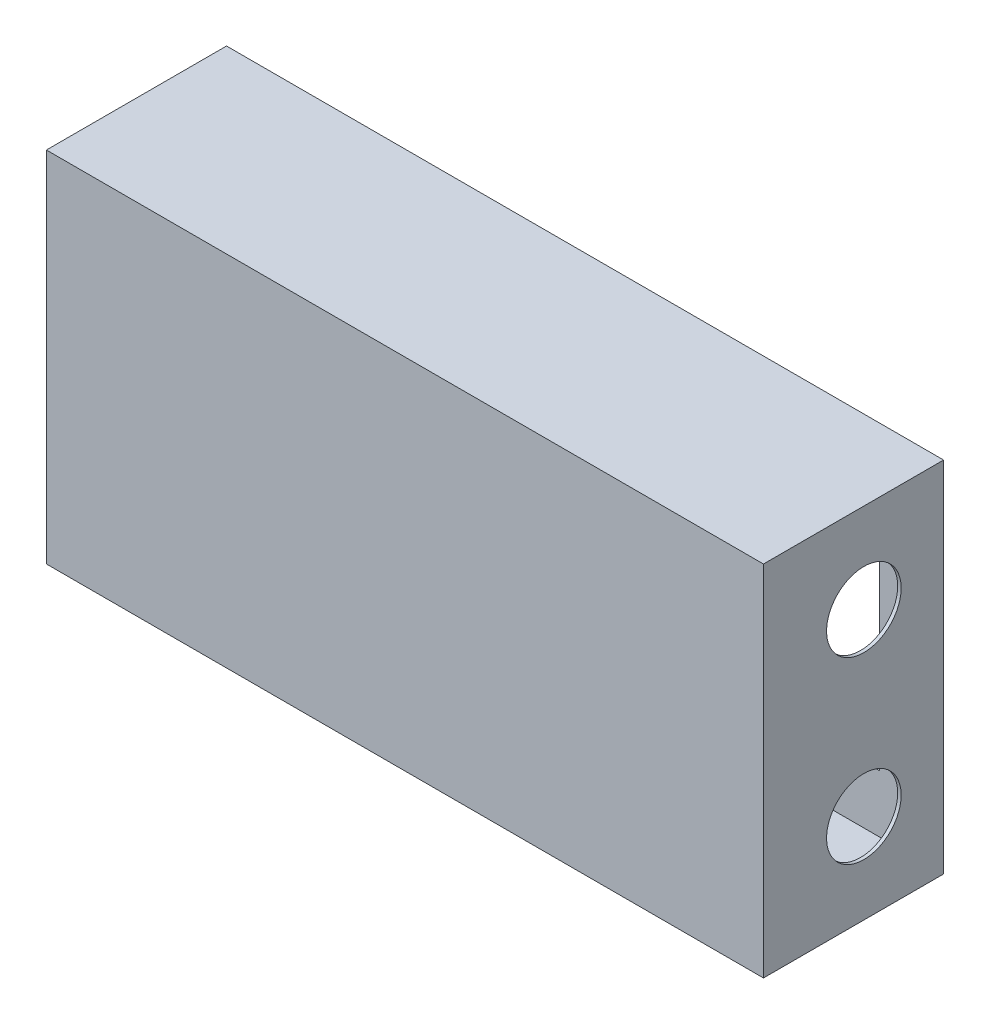
ISO-10303-21;
HEADER;
FILE_DESCRIPTION(('STEP AP214'),'2;1');
FILE_NAME('part.step','',(''),(''),'','','');
FILE_SCHEMA(('AUTOMOTIVE_DESIGN { 1 0 10303 214 1 1 1 1 }'));
ENDSEC;
DATA;
#1=APPLICATION_CONTEXT('core data for automotive mechanical design processes');
#2=APPLICATION_PROTOCOL_DEFINITION('international standard','automotive_design',2000,#1);
#3=PRODUCT_CONTEXT('',#1,'mechanical');
#4=PRODUCT('Part','Part','',(#3));
#5=PRODUCT_RELATED_PRODUCT_CATEGORY('part','',(#4));
#6=PRODUCT_DEFINITION_FORMATION('','',#4);
#7=PRODUCT_DEFINITION_CONTEXT('part definition',#1,'design');
#8=PRODUCT_DEFINITION('design','',#6,#7);
#9=PRODUCT_DEFINITION_SHAPE('','',#8);
#10=(LENGTH_UNIT() NAMED_UNIT(*) SI_UNIT(.MILLI.,.METRE.));
#11=(NAMED_UNIT(*) PLANE_ANGLE_UNIT() SI_UNIT($,.RADIAN.));
#12=(NAMED_UNIT(*) SI_UNIT($,.STERADIAN.) SOLID_ANGLE_UNIT());
#13=UNCERTAINTY_MEASURE_WITH_UNIT(LENGTH_MEASURE(1.E-05),#10,'distance_accuracy_value','');
#14=(GEOMETRIC_REPRESENTATION_CONTEXT(3) GLOBAL_UNCERTAINTY_ASSIGNED_CONTEXT((#13)) GLOBAL_UNIT_ASSIGNED_CONTEXT((#10,
#11,#12)) REPRESENTATION_CONTEXT('',''));
#15=CARTESIAN_POINT('',(0.,0.,0.));
#16=DIRECTION('',(0.,0.,1.));
#17=DIRECTION('',(1.,0.,0.));
#18=AXIS2_PLACEMENT_3D('',#15,#16,#17);
#19=CARTESIAN_POINT('',(400.,0.,73.6));
#20=DIRECTION('',(0.,0.,1.));
#21=DIRECTION('',(1.,0.,0.));
#22=AXIS2_PLACEMENT_3D('',#19,#20,#21);
#23=PLANE('',#22);
#24=DIRECTION('',(-1.,0.,0.));
#25=VECTOR('',#24,1.);
#26=CARTESIAN_POINT('',(-115.,-42.5,73.6));
#27=LINE('',#26,#25);
#28=CARTESIAN_POINT('',(115.,-42.5,73.6));
#29=VERTEX_POINT('',#28);
#30=CARTESIAN_POINT('',(-115.,-42.5,73.6));
#31=VERTEX_POINT('',#30);
#32=EDGE_CURVE('E142',#29,#31,#27,.T.);
#33=ORIENTED_EDGE('',*,*,#32,.F.);
#34=DIRECTION('',(0.,-1.,0.));
#35=VECTOR('',#34,1.);
#36=CARTESIAN_POINT('',(115.,-42.5,73.6));
#37=LINE('',#36,#35);
#38=CARTESIAN_POINT('',(115.,42.5,73.6));
#39=VERTEX_POINT('',#38);
#40=EDGE_CURVE('E90',#39,#29,#37,.T.);
#41=ORIENTED_EDGE('',*,*,#40,.F.);
#42=DIRECTION('',(1.,0.,0.));
#43=VECTOR('',#42,1.);
#44=CARTESIAN_POINT('',(-115.,42.5,73.6));
#45=LINE('',#44,#43);
#46=CARTESIAN_POINT('',(-115.,42.5,73.6));
#47=VERTEX_POINT('',#46);
#48=EDGE_CURVE('E170',#47,#39,#45,.T.);
#49=ORIENTED_EDGE('',*,*,#48,.F.);
#50=DIRECTION('',(0.,1.,0.));
#51=VECTOR('',#50,1.);
#52=CARTESIAN_POINT('',(-115.,-42.5,73.6));
#53=LINE('',#52,#51);
#54=EDGE_CURVE('E146',#31,#47,#53,.T.);
#55=ORIENTED_EDGE('',*,*,#54,.F.);
#56=EDGE_LOOP('',(#33,#41,#49,#55));
#57=FACE_BOUND('',#56,.T.);
#58=DIRECTION('',(0.,-1.,0.));
#59=VECTOR('',#58,1.);
#60=CARTESIAN_POINT('',(113.8,0.,73.6));
#61=LINE('',#60,#59);
#62=CARTESIAN_POINT('',(113.8,41.3,73.6));
#63=VERTEX_POINT('',#62);
#64=CARTESIAN_POINT('',(113.8,-41.3,73.6));
#65=VERTEX_POINT('',#64);
#66=EDGE_CURVE('E137',#63,#65,#61,.T.);
#67=ORIENTED_EDGE('',*,*,#66,.T.);
#68=DIRECTION('',(-1.,0.,0.));
#69=VECTOR('',#68,1.);
#70=CARTESIAN_POINT('',(400.,-41.3000000000001,73.6));
#71=LINE('',#70,#69);
#72=CARTESIAN_POINT('',(-113.8,-41.3,73.6));
#73=VERTEX_POINT('',#72);
#74=EDGE_CURVE('E156',#65,#73,#71,.T.);
#75=ORIENTED_EDGE('',*,*,#74,.T.);
#76=DIRECTION('',(0.,1.,0.));
#77=VECTOR('',#76,1.);
#78=CARTESIAN_POINT('',(-113.8,0.,73.6));
#79=LINE('',#78,#77);
#80=CARTESIAN_POINT('',(-113.8,41.3,73.6));
#81=VERTEX_POINT('',#80);
#82=EDGE_CURVE('E141',#73,#81,#79,.T.);
#83=ORIENTED_EDGE('',*,*,#82,.T.);
#84=DIRECTION('',(1.,0.,0.));
#85=VECTOR('',#84,1.);
#86=CARTESIAN_POINT('',(400.,41.2999999999999,73.6));
#87=LINE('',#86,#85);
#88=EDGE_CURVE('E60',#81,#63,#87,.T.);
#89=ORIENTED_EDGE('',*,*,#88,.T.);
#90=EDGE_LOOP('',(#67,#75,#83,#89));
#91=FACE_BOUND('',#90,.T.);
#92=ADVANCED_FACE('F45',(#57,#91),#23,.T.);
#93=CARTESIAN_POINT('',(-115.,-42.5,58.6));
#94=DIRECTION('',(0.,1.,0.));
#95=DIRECTION('',(-1.,0.,0.));
#96=AXIS2_PLACEMENT_3D('',#93,#94,#95);
#97=PLANE('',#96);
#98=ORIENTED_EDGE('',*,*,#32,.T.);
#99=DIRECTION('',(0.,0.,1.));
#100=VECTOR('',#99,1.);
#101=CARTESIAN_POINT('',(-115.,-42.5,58.6));
#102=LINE('',#101,#100);
#103=CARTESIAN_POINT('',(-115.,-42.5,58.6));
#104=VERTEX_POINT('',#103);
#105=EDGE_CURVE('E12',#104,#31,#102,.T.);
#106=ORIENTED_EDGE('',*,*,#105,.F.);
#107=DIRECTION('',(-1.,0.,0.));
#108=VECTOR('',#107,1.);
#109=CARTESIAN_POINT('',(-115.,-42.5,58.6));
#110=LINE('',#109,#108);
#111=CARTESIAN_POINT('',(115.,-42.5,58.6));
#112=VERTEX_POINT('',#111);
#113=EDGE_CURVE('E162',#112,#104,#110,.T.);
#114=ORIENTED_EDGE('',*,*,#113,.F.);
#115=DIRECTION('',(0.,0.,1.));
#116=VECTOR('',#115,1.);
#117=CARTESIAN_POINT('',(115.,-42.5,58.6));
#118=LINE('',#117,#116);
#119=EDGE_CURVE('E167',#112,#29,#118,.T.);
#120=ORIENTED_EDGE('',*,*,#119,.T.);
#121=EDGE_LOOP('',(#98,#106,#114,#120));
#122=FACE_BOUND('',#121,.T.);
#123=ADVANCED_FACE('F47',(#122),#97,.F.);
#124=CARTESIAN_POINT('',(-115.,-42.5,58.6));
#125=DIRECTION('',(1.,0.,0.));
#126=DIRECTION('',(0.,0.,-1.));
#127=AXIS2_PLACEMENT_3D('',#124,#125,#126);
#128=PLANE('',#127);
#129=ORIENTED_EDGE('',*,*,#54,.T.);
#130=DIRECTION('',(0.,0.,1.));
#131=VECTOR('',#130,1.);
#132=CARTESIAN_POINT('',(-115.,42.5,58.6));
#133=LINE('',#132,#131);
#134=CARTESIAN_POINT('',(-115.,42.5,58.6));
#135=VERTEX_POINT('',#134);
#136=EDGE_CURVE('E53',#135,#47,#133,.T.);
#137=ORIENTED_EDGE('',*,*,#136,.F.);
#138=DIRECTION('',(0.,1.,0.));
#139=VECTOR('',#138,1.);
#140=CARTESIAN_POINT('',(-115.,-42.5,58.6));
#141=LINE('',#140,#139);
#142=EDGE_CURVE('E97',#104,#135,#141,.T.);
#143=ORIENTED_EDGE('',*,*,#142,.F.);
#144=ORIENTED_EDGE('',*,*,#105,.T.);
#145=EDGE_LOOP('',(#129,#137,#143,#144));
#146=FACE_BOUND('',#145,.T.);
#147=ADVANCED_FACE('F196',(#146),#128,.F.);
#148=CARTESIAN_POINT('',(-115.,42.5,58.6));
#149=DIRECTION('',(0.,-1.,0.));
#150=DIRECTION('',(1.,0.,0.));
#151=AXIS2_PLACEMENT_3D('',#148,#149,#150);
#152=PLANE('',#151);
#153=ORIENTED_EDGE('',*,*,#48,.T.);
#154=DIRECTION('',(0.,0.,1.));
#155=VECTOR('',#154,1.);
#156=CARTESIAN_POINT('',(115.,42.5,58.6));
#157=LINE('',#156,#155);
#158=CARTESIAN_POINT('',(115.,42.5,58.6));
#159=VERTEX_POINT('',#158);
#160=EDGE_CURVE('E174',#159,#39,#157,.T.);
#161=ORIENTED_EDGE('',*,*,#160,.F.);
#162=DIRECTION('',(1.,0.,0.));
#163=VECTOR('',#162,1.);
#164=CARTESIAN_POINT('',(-115.,42.5,58.6));
#165=LINE('',#164,#163);
#166=EDGE_CURVE('E165',#135,#159,#165,.T.);
#167=ORIENTED_EDGE('',*,*,#166,.F.);
#168=ORIENTED_EDGE('',*,*,#136,.T.);
#169=EDGE_LOOP('',(#153,#161,#167,#168));
#170=FACE_BOUND('',#169,.T.);
#171=ADVANCED_FACE('F179',(#170),#152,.F.);
#172=CARTESIAN_POINT('',(115.,-42.5,58.6));
#173=DIRECTION('',(-1.,0.,0.));
#174=DIRECTION('',(0.,0.,1.));
#175=AXIS2_PLACEMENT_3D('',#172,#173,#174);
#176=PLANE('',#175);
#177=ORIENTED_EDGE('',*,*,#40,.T.);
#178=ORIENTED_EDGE('',*,*,#119,.F.);
#179=DIRECTION('',(0.,-1.,0.));
#180=VECTOR('',#179,1.);
#181=CARTESIAN_POINT('',(115.,-42.5,58.6));
#182=LINE('',#181,#180);
#183=EDGE_CURVE('E69',#159,#112,#182,.T.);
#184=ORIENTED_EDGE('',*,*,#183,.F.);
#185=ORIENTED_EDGE('',*,*,#160,.T.);
#186=EDGE_LOOP('',(#177,#178,#184,#185));
#187=FACE_BOUND('',#186,.T.);
#188=ADVANCED_FACE('F187',(#187),#176,.F.);
#189=CARTESIAN_POINT('',(400.,0.,58.6));
#190=DIRECTION('',(0.,0.,1.));
#191=DIRECTION('',(1.,0.,0.));
#192=AXIS2_PLACEMENT_3D('',#189,#190,#191);
#193=PLANE('',#192);
#194=ORIENTED_EDGE('',*,*,#113,.T.);
#195=ORIENTED_EDGE('',*,*,#142,.T.);
#196=ORIENTED_EDGE('',*,*,#166,.T.);
#197=ORIENTED_EDGE('',*,*,#183,.T.);
#198=EDGE_LOOP('',(#194,#195,#196,#197));
#199=FACE_BOUND('',#198,.T.);
#200=ADVANCED_FACE('F189',(#199),#193,.F.);
#201=CARTESIAN_POINT('',(-115.,-41.3,58.6));
#202=DIRECTION('',(0.,1.,0.));
#203=DIRECTION('',(-1.,0.,0.));
#204=AXIS2_PLACEMENT_3D('',#201,#202,#203);
#205=PLANE('',#204);
#206=ORIENTED_EDGE('',*,*,#74,.F.);
#207=DIRECTION('',(0.,0.,1.));
#208=VECTOR('',#207,1.);
#209=CARTESIAN_POINT('',(113.8,-41.3,58.6));
#210=LINE('',#209,#208);
#211=CARTESIAN_POINT('',(113.8,-41.3,59.8));
#212=VERTEX_POINT('',#211);
#213=EDGE_CURVE('E136',#212,#65,#210,.T.);
#214=ORIENTED_EDGE('',*,*,#213,.F.);
#215=DIRECTION('',(-1.,0.,0.));
#216=VECTOR('',#215,1.);
#217=CARTESIAN_POINT('',(400.,-41.3000000000001,59.8));
#218=LINE('',#217,#216);
#219=CARTESIAN_POINT('',(-113.8,-41.3,59.8));
#220=VERTEX_POINT('',#219);
#221=EDGE_CURVE('E124',#212,#220,#218,.T.);
#222=ORIENTED_EDGE('',*,*,#221,.T.);
#223=DIRECTION('',(0.,0.,1.));
#224=VECTOR('',#223,1.);
#225=CARTESIAN_POINT('',(-113.8,-41.3,58.6));
#226=LINE('',#225,#224);
#227=EDGE_CURVE('E134',#220,#73,#226,.T.);
#228=ORIENTED_EDGE('',*,*,#227,.T.);
#229=EDGE_LOOP('',(#206,#214,#222,#228));
#230=FACE_BOUND('',#229,.T.);
#231=ADVANCED_FACE('F133',(#230),#205,.T.);
#232=CARTESIAN_POINT('',(-113.8,-42.5,58.6));
#233=DIRECTION('',(1.,0.,0.));
#234=DIRECTION('',(0.,0.,-1.));
#235=AXIS2_PLACEMENT_3D('',#232,#233,#234);
#236=PLANE('',#235);
#237=ORIENTED_EDGE('',*,*,#82,.F.);
#238=ORIENTED_EDGE('',*,*,#227,.F.);
#239=DIRECTION('',(0.,1.,0.));
#240=VECTOR('',#239,1.);
#241=CARTESIAN_POINT('',(-113.8,0.,59.8));
#242=LINE('',#241,#240);
#243=CARTESIAN_POINT('',(-113.8,41.3,59.8));
#244=VERTEX_POINT('',#243);
#245=EDGE_CURVE('E120',#220,#244,#242,.T.);
#246=ORIENTED_EDGE('',*,*,#245,.T.);
#247=DIRECTION('',(0.,0.,1.));
#248=VECTOR('',#247,1.);
#249=CARTESIAN_POINT('',(-113.8,41.3,58.6));
#250=LINE('',#249,#248);
#251=EDGE_CURVE('E143',#244,#81,#250,.T.);
#252=ORIENTED_EDGE('',*,*,#251,.T.);
#253=EDGE_LOOP('',(#237,#238,#246,#252));
#254=FACE_BOUND('',#253,.T.);
#255=ADVANCED_FACE('F139',(#254),#236,.T.);
#256=CARTESIAN_POINT('',(-115.,41.3,58.6));
#257=DIRECTION('',(0.,-1.,0.));
#258=DIRECTION('',(1.,0.,0.));
#259=AXIS2_PLACEMENT_3D('',#256,#257,#258);
#260=PLANE('',#259);
#261=ORIENTED_EDGE('',*,*,#88,.F.);
#262=ORIENTED_EDGE('',*,*,#251,.F.);
#263=DIRECTION('',(1.,0.,0.));
#264=VECTOR('',#263,1.);
#265=CARTESIAN_POINT('',(400.,41.2999999999999,59.8));
#266=LINE('',#265,#264);
#267=CARTESIAN_POINT('',(113.8,41.3,59.8));
#268=VERTEX_POINT('',#267);
#269=EDGE_CURVE('E125',#244,#268,#266,.T.);
#270=ORIENTED_EDGE('',*,*,#269,.T.);
#271=DIRECTION('',(0.,0.,1.));
#272=VECTOR('',#271,1.);
#273=CARTESIAN_POINT('',(113.8,41.3,58.6));
#274=LINE('',#273,#272);
#275=EDGE_CURVE('E148',#268,#63,#274,.T.);
#276=ORIENTED_EDGE('',*,*,#275,.T.);
#277=EDGE_LOOP('',(#261,#262,#270,#276));
#278=FACE_BOUND('',#277,.T.);
#279=ADVANCED_FACE('F209',(#278),#260,.T.);
#280=CARTESIAN_POINT('',(113.8,-42.5,58.6));
#281=DIRECTION('',(-1.,0.,0.));
#282=DIRECTION('',(0.,0.,1.));
#283=AXIS2_PLACEMENT_3D('',#280,#281,#282);
#284=PLANE('',#283);
#285=ORIENTED_EDGE('',*,*,#66,.F.);
#286=ORIENTED_EDGE('',*,*,#275,.F.);
#287=DIRECTION('',(0.,-1.,0.));
#288=VECTOR('',#287,1.);
#289=CARTESIAN_POINT('',(113.8,0.,59.8));
#290=LINE('',#289,#288);
#291=EDGE_CURVE('E151',#268,#212,#290,.T.);
#292=ORIENTED_EDGE('',*,*,#291,.T.);
#293=ORIENTED_EDGE('',*,*,#213,.T.);
#294=EDGE_LOOP('',(#285,#286,#292,#293));
#295=FACE_BOUND('',#294,.T.);
#296=ADVANCED_FACE('F206',(#295),#284,.T.);
#297=CARTESIAN_POINT('',(400.,0.,59.8));
#298=DIRECTION('',(0.,0.,1.));
#299=DIRECTION('',(1.,0.,0.));
#300=AXIS2_PLACEMENT_3D('',#297,#298,#299);
#301=PLANE('',#300);
#302=ORIENTED_EDGE('',*,*,#221,.F.);
#303=ORIENTED_EDGE('',*,*,#291,.F.);
#304=ORIENTED_EDGE('',*,*,#269,.F.);
#305=ORIENTED_EDGE('',*,*,#245,.F.);
#306=EDGE_LOOP('',(#302,#303,#304,#305));
#307=FACE_BOUND('',#306,.T.);
#308=ADVANCED_FACE('F122',(#307),#301,.T.);
#309=CLOSED_SHELL('',(#92,#123,#147,#171,#188,#200,#231,#255,#279,#296,#308));
#310=MANIFOLD_SOLID_BREP('B2',#309);
#311=CARTESIAN_POINT('',(-125.,-62.5,74.8));
#312=DIRECTION('',(0.,1.,0.));
#313=DIRECTION('',(-1.,0.,0.));
#314=AXIS2_PLACEMENT_3D('',#311,#312,#313);
#315=PLANE('',#314);
#316=DIRECTION('',(0.,0.,-1.));
#317=VECTOR('',#316,1.);
#318=CARTESIAN_POINT('',(-125.,-62.5,74.8));
#319=LINE('',#318,#317);
#320=CARTESIAN_POINT('',(-125.,-62.5,74.8));
#321=VERTEX_POINT('',#320);
#322=CARTESIAN_POINT('',(-125.,-62.5,12.));
#323=VERTEX_POINT('',#322);
#324=EDGE_CURVE('E592',#321,#323,#319,.T.);
#325=ORIENTED_EDGE('',*,*,#324,.T.);
#326=DIRECTION('',(1.,0.,0.));
#327=VECTOR('',#326,1.);
#328=CARTESIAN_POINT('',(-125.,-62.5,12.));
#329=LINE('',#328,#327);
#330=CARTESIAN_POINT('',(125.,-62.5,12.));
#331=VERTEX_POINT('',#330);
#332=EDGE_CURVE('E307',#323,#331,#329,.T.);
#333=ORIENTED_EDGE('',*,*,#332,.T.);
#334=DIRECTION('',(0.,0.,-1.));
#335=VECTOR('',#334,1.);
#336=CARTESIAN_POINT('',(125.,-62.5,74.8));
#337=LINE('',#336,#335);
#338=CARTESIAN_POINT('',(125.,-62.5,74.8));
#339=VERTEX_POINT('',#338);
#340=EDGE_CURVE('E43',#339,#331,#337,.T.);
#341=ORIENTED_EDGE('',*,*,#340,.F.);
#342=DIRECTION('',(1.,0.,0.));
#343=VECTOR('',#342,1.);
#344=CARTESIAN_POINT('',(-125.,-62.5,74.8));
#345=LINE('',#344,#343);
#346=EDGE_CURVE('E583',#321,#339,#345,.T.);
#347=ORIENTED_EDGE('',*,*,#346,.F.);
#348=EDGE_LOOP('',(#325,#333,#341,#347));
#349=FACE_BOUND('',#348,.T.);
#350=ADVANCED_FACE('F283',(#349),#315,.F.);
#351=CARTESIAN_POINT('',(125.,-62.5,74.8));
#352=DIRECTION('',(-1.,0.,0.));
#353=DIRECTION('',(0.,0.,1.));
#354=AXIS2_PLACEMENT_3D('',#351,#352,#353);
#355=PLANE('',#354);
#356=CARTESIAN_POINT('',(125.,-31.25,39.8));
#357=DIRECTION('',(1.,0.,0.));
#358=DIRECTION('',(0.,0.,-1.));
#359=AXIS2_PLACEMENT_3D('',#356,#357,#358);
#360=CIRCLE('',#359,13.);
#361=CARTESIAN_POINT('',(125.,-31.25,26.8));
#362=VERTEX_POINT('',#361);
#363=EDGE_CURVE('E610',#362,#362,#360,.T.);
#364=ORIENTED_EDGE('',*,*,#363,.F.);
#365=EDGE_LOOP('',(#364));
#366=FACE_BOUND('',#365,.T.);
#367=CARTESIAN_POINT('',(125.,31.25,39.8));
#368=DIRECTION('',(1.,0.,0.));
#369=DIRECTION('',(0.,0.,-1.));
#370=AXIS2_PLACEMENT_3D('',#367,#368,#369);
#371=CIRCLE('',#370,13.);
#372=CARTESIAN_POINT('',(125.,31.25,26.8));
#373=VERTEX_POINT('',#372);
#374=EDGE_CURVE('E601',#373,#373,#371,.T.);
#375=ORIENTED_EDGE('',*,*,#374,.F.);
#376=EDGE_LOOP('',(#375));
#377=FACE_BOUND('',#376,.T.);
#378=ORIENTED_EDGE('',*,*,#340,.T.);
#379=DIRECTION('',(0.,1.,0.));
#380=VECTOR('',#379,1.);
#381=CARTESIAN_POINT('',(125.,-62.5,12.));
#382=LINE('',#381,#380);
#383=CARTESIAN_POINT('',(125.,62.5,12.));
#384=VERTEX_POINT('',#383);
#385=EDGE_CURVE('E580',#331,#384,#382,.T.);
#386=ORIENTED_EDGE('',*,*,#385,.T.);
#387=DIRECTION('',(0.,0.,-1.));
#388=VECTOR('',#387,1.);
#389=CARTESIAN_POINT('',(125.,62.5,74.8));
#390=LINE('',#389,#388);
#391=CARTESIAN_POINT('',(125.,62.5,74.8));
#392=VERTEX_POINT('',#391);
#393=EDGE_CURVE('E291',#392,#384,#390,.T.);
#394=ORIENTED_EDGE('',*,*,#393,.F.);
#395=DIRECTION('',(0.,1.,0.));
#396=VECTOR('',#395,1.);
#397=CARTESIAN_POINT('',(125.,-62.5,74.8));
#398=LINE('',#397,#396);
#399=EDGE_CURVE('E586',#339,#392,#398,.T.);
#400=ORIENTED_EDGE('',*,*,#399,.F.);
#401=EDGE_LOOP('',(#378,#386,#394,#400));
#402=FACE_BOUND('',#401,.T.);
#403=ADVANCED_FACE('F632',(#366,#377,#402),#355,.F.);
#404=CARTESIAN_POINT('',(-125.,62.5,74.8));
#405=DIRECTION('',(0.,-1.,0.));
#406=DIRECTION('',(0.,0.,-1.));
#407=AXIS2_PLACEMENT_3D('',#404,#405,#406);
#408=PLANE('',#407);
#409=ORIENTED_EDGE('',*,*,#393,.T.);
#410=DIRECTION('',(-1.,0.,0.));
#411=VECTOR('',#410,1.);
#412=CARTESIAN_POINT('',(125.,62.5,12.));
#413=LINE('',#412,#411);
#414=CARTESIAN_POINT('',(-125.,62.5,12.));
#415=VERTEX_POINT('',#414);
#416=EDGE_CURVE('E574',#384,#415,#413,.T.);
#417=ORIENTED_EDGE('',*,*,#416,.T.);
#418=DIRECTION('',(0.,0.,-1.));
#419=VECTOR('',#418,1.);
#420=CARTESIAN_POINT('',(-125.,62.5,74.8));
#421=LINE('',#420,#419);
#422=CARTESIAN_POINT('',(-125.,62.5,74.8));
#423=VERTEX_POINT('',#422);
#424=EDGE_CURVE('E595',#423,#415,#421,.T.);
#425=ORIENTED_EDGE('',*,*,#424,.F.);
#426=DIRECTION('',(-1.,0.,0.));
#427=VECTOR('',#426,1.);
#428=CARTESIAN_POINT('',(-125.,62.5,74.8));
#429=LINE('',#428,#427);
#430=EDGE_CURVE('E588',#392,#423,#429,.T.);
#431=ORIENTED_EDGE('',*,*,#430,.F.);
#432=EDGE_LOOP('',(#409,#417,#425,#431));
#433=FACE_BOUND('',#432,.T.);
#434=ADVANCED_FACE('F621',(#433),#408,.F.);
#435=CARTESIAN_POINT('',(-125.,-62.5,74.8));
#436=DIRECTION('',(1.,0.,0.));
#437=DIRECTION('',(0.,0.,-1.));
#438=AXIS2_PLACEMENT_3D('',#435,#436,#437);
#439=PLANE('',#438);
#440=CARTESIAN_POINT('',(-125.,0.,39.8));
#441=DIRECTION('',(-1.,0.,0.));
#442=DIRECTION('',(0.,0.,1.));
#443=AXIS2_PLACEMENT_3D('',#440,#441,#442);
#444=CIRCLE('',#443,13.);
#445=CARTESIAN_POINT('',(-125.,0.,52.8));
#446=VERTEX_POINT('',#445);
#447=EDGE_CURVE('E515',#446,#446,#444,.T.);
#448=ORIENTED_EDGE('',*,*,#447,.F.);
#449=EDGE_LOOP('',(#448));
#450=FACE_BOUND('',#449,.T.);
#451=ORIENTED_EDGE('',*,*,#424,.T.);
#452=DIRECTION('',(0.,-1.,0.));
#453=VECTOR('',#452,1.);
#454=CARTESIAN_POINT('',(-125.,62.5,12.));
#455=LINE('',#454,#453);
#456=EDGE_CURVE('E577',#415,#323,#455,.T.);
#457=ORIENTED_EDGE('',*,*,#456,.T.);
#458=ORIENTED_EDGE('',*,*,#324,.F.);
#459=DIRECTION('',(0.,-1.,0.));
#460=VECTOR('',#459,1.);
#461=CARTESIAN_POINT('',(-125.,-62.5,74.8));
#462=LINE('',#461,#460);
#463=EDGE_CURVE('E590',#423,#321,#462,.T.);
#464=ORIENTED_EDGE('',*,*,#463,.F.);
#465=EDGE_LOOP('',(#451,#457,#458,#464));
#466=FACE_BOUND('',#465,.T.);
#467=ADVANCED_FACE('F617',(#450,#466),#439,.F.);
#468=CARTESIAN_POINT('',(0.,0.,74.8));
#469=DIRECTION('',(0.,0.,1.));
#470=DIRECTION('',(1.,0.,0.));
#471=AXIS2_PLACEMENT_3D('',#468,#469,#470);
#472=PLANE('',#471);
#473=ORIENTED_EDGE('',*,*,#346,.T.);
#474=ORIENTED_EDGE('',*,*,#399,.T.);
#475=ORIENTED_EDGE('',*,*,#430,.T.);
#476=ORIENTED_EDGE('',*,*,#463,.T.);
#477=EDGE_LOOP('',(#473,#474,#475,#476));
#478=FACE_BOUND('',#477,.T.);
#479=ADVANCED_FACE('F620',(#478),#472,.T.);
#480=CARTESIAN_POINT('',(0.,0.,12.));
#481=DIRECTION('',(0.,0.,1.));
#482=DIRECTION('',(1.,0.,0.));
#483=AXIS2_PLACEMENT_3D('',#480,#481,#482);
#484=PLANE('',#483);
#485=ORIENTED_EDGE('',*,*,#416,.F.);
#486=ORIENTED_EDGE('',*,*,#385,.F.);
#487=ORIENTED_EDGE('',*,*,#332,.F.);
#488=ORIENTED_EDGE('',*,*,#456,.F.);
#489=EDGE_LOOP('',(#485,#486,#487,#488));
#490=FACE_BOUND('',#489,.T.);
#491=DIRECTION('',(-1.,0.,0.));
#492=VECTOR('',#491,1.);
#493=CARTESIAN_POINT('',(105.,42.5,12.));
#494=LINE('',#493,#492);
#495=CARTESIAN_POINT('',(105.,42.5,12.));
#496=VERTEX_POINT('',#495);
#497=CARTESIAN_POINT('',(-105.,42.5,12.));
#498=VERTEX_POINT('',#497);
#499=EDGE_CURVE('E544',#496,#498,#494,.T.);
#500=ORIENTED_EDGE('',*,*,#499,.T.);
#501=DIRECTION('',(0.,-1.,0.));
#502=VECTOR('',#501,1.);
#503=CARTESIAN_POINT('',(-105.,42.5,12.));
#504=LINE('',#503,#502);
#505=CARTESIAN_POINT('',(-105.,-42.5,12.));
#506=VERTEX_POINT('',#505);
#507=EDGE_CURVE('E547',#498,#506,#504,.T.);
#508=ORIENTED_EDGE('',*,*,#507,.T.);
#509=DIRECTION('',(1.,0.,0.));
#510=VECTOR('',#509,1.);
#511=CARTESIAN_POINT('',(-105.,-42.5,12.));
#512=LINE('',#511,#510);
#513=CARTESIAN_POINT('',(105.,-42.5,12.));
#514=VERTEX_POINT('',#513);
#515=EDGE_CURVE('E550',#506,#514,#512,.T.);
#516=ORIENTED_EDGE('',*,*,#515,.T.);
#517=DIRECTION('',(0.,1.,0.));
#518=VECTOR('',#517,1.);
#519=CARTESIAN_POINT('',(105.,-42.5,12.));
#520=LINE('',#519,#518);
#521=EDGE_CURVE('E542',#514,#496,#520,.T.);
#522=ORIENTED_EDGE('',*,*,#521,.T.);
#523=EDGE_LOOP('',(#500,#508,#516,#522));
#524=FACE_BOUND('',#523,.T.);
#525=ADVANCED_FACE('F629',(#490,#524),#484,.F.);
#526=CARTESIAN_POINT('',(105.,-42.5,12.));
#527=DIRECTION('',(-1.,0.,0.));
#528=DIRECTION('',(0.,0.,1.));
#529=AXIS2_PLACEMENT_3D('',#526,#527,#528);
#530=PLANE('',#529);
#531=DIRECTION('',(0.,1.,0.));
#532=VECTOR('',#531,1.);
#533=CARTESIAN_POINT('',(105.,-42.5,0.));
#534=LINE('',#533,#532);
#535=CARTESIAN_POINT('',(105.,-42.5,0.));
#536=VERTEX_POINT('',#535);
#537=CARTESIAN_POINT('',(105.,42.5,0.));
#538=VERTEX_POINT('',#537);
#539=EDGE_CURVE('E523',#536,#538,#534,.T.);
#540=ORIENTED_EDGE('',*,*,#539,.T.);
#541=DIRECTION('',(0.,0.,-1.));
#542=VECTOR('',#541,1.);
#543=CARTESIAN_POINT('',(105.,42.5,12.));
#544=LINE('',#543,#542);
#545=EDGE_CURVE('E571',#496,#538,#544,.T.);
#546=ORIENTED_EDGE('',*,*,#545,.F.);
#547=ORIENTED_EDGE('',*,*,#521,.F.);
#548=DIRECTION('',(0.,0.,-1.));
#549=VECTOR('',#548,1.);
#550=CARTESIAN_POINT('',(105.,-42.5,12.));
#551=LINE('',#550,#549);
#552=EDGE_CURVE('E552',#514,#536,#551,.T.);
#553=ORIENTED_EDGE('',*,*,#552,.T.);
#554=EDGE_LOOP('',(#540,#546,#547,#553));
#555=FACE_BOUND('',#554,.T.);
#556=ADVANCED_FACE('F642',(#555),#530,.F.);
#557=CARTESIAN_POINT('',(105.,42.5,12.));
#558=DIRECTION('',(0.,-1.,0.));
#559=DIRECTION('',(0.,0.,-1.));
#560=AXIS2_PLACEMENT_3D('',#557,#558,#559);
#561=PLANE('',#560);
#562=DIRECTION('',(-1.,0.,0.));
#563=VECTOR('',#562,1.);
#564=CARTESIAN_POINT('',(105.,42.5,0.));
#565=LINE('',#564,#563);
#566=CARTESIAN_POINT('',(-105.,42.5,0.));
#567=VERTEX_POINT('',#566);
#568=EDGE_CURVE('E555',#538,#567,#565,.T.);
#569=ORIENTED_EDGE('',*,*,#568,.T.);
#570=DIRECTION('',(0.,0.,-1.));
#571=VECTOR('',#570,1.);
#572=CARTESIAN_POINT('',(-105.,42.5,12.));
#573=LINE('',#572,#571);
#574=EDGE_CURVE('E568',#498,#567,#573,.T.);
#575=ORIENTED_EDGE('',*,*,#574,.F.);
#576=ORIENTED_EDGE('',*,*,#499,.F.);
#577=ORIENTED_EDGE('',*,*,#545,.T.);
#578=EDGE_LOOP('',(#569,#575,#576,#577));
#579=FACE_BOUND('',#578,.T.);
#580=ADVANCED_FACE('F747',(#579),#561,.F.);
#581=CARTESIAN_POINT('',(-105.,42.5,12.));
#582=DIRECTION('',(1.,0.,0.));
#583=DIRECTION('',(0.,0.,-1.));
#584=AXIS2_PLACEMENT_3D('',#581,#582,#583);
#585=PLANE('',#584);
#586=DIRECTION('',(0.,-1.,0.));
#587=VECTOR('',#586,1.);
#588=CARTESIAN_POINT('',(-105.,42.5,0.));
#589=LINE('',#588,#587);
#590=CARTESIAN_POINT('',(-105.,-42.5,0.));
#591=VERTEX_POINT('',#590);
#592=EDGE_CURVE('E558',#567,#591,#589,.T.);
#593=ORIENTED_EDGE('',*,*,#592,.T.);
#594=DIRECTION('',(0.,0.,-1.));
#595=VECTOR('',#594,1.);
#596=CARTESIAN_POINT('',(-105.,-42.5,12.));
#597=LINE('',#596,#595);
#598=EDGE_CURVE('E565',#506,#591,#597,.T.);
#599=ORIENTED_EDGE('',*,*,#598,.F.);
#600=ORIENTED_EDGE('',*,*,#507,.F.);
#601=ORIENTED_EDGE('',*,*,#574,.T.);
#602=EDGE_LOOP('',(#593,#599,#600,#601));
#603=FACE_BOUND('',#602,.T.);
#604=ADVANCED_FACE('F743',(#603),#585,.F.);
#605=CARTESIAN_POINT('',(-105.,-42.5,12.));
#606=DIRECTION('',(0.,1.,0.));
#607=DIRECTION('',(0.,0.,1.));
#608=AXIS2_PLACEMENT_3D('',#605,#606,#607);
#609=PLANE('',#608);
#610=DIRECTION('',(1.,0.,0.));
#611=VECTOR('',#610,1.);
#612=CARTESIAN_POINT('',(-105.,-42.5,0.));
#613=LINE('',#612,#611);
#614=EDGE_CURVE('E545',#591,#536,#613,.T.);
#615=ORIENTED_EDGE('',*,*,#614,.T.);
#616=ORIENTED_EDGE('',*,*,#552,.F.);
#617=ORIENTED_EDGE('',*,*,#515,.F.);
#618=ORIENTED_EDGE('',*,*,#598,.T.);
#619=EDGE_LOOP('',(#615,#616,#617,#618));
#620=FACE_BOUND('',#619,.T.);
#621=ADVANCED_FACE('F729',(#620),#609,.F.);
#622=CARTESIAN_POINT('',(105.,-42.5,0.));
#623=DIRECTION('',(0.707106781186546,0.,0.707106781186549));
#624=DIRECTION('',(0.707106781186549,0.,-0.707106781186546));
#625=AXIS2_PLACEMENT_3D('',#622,#623,#624);
#626=PLANE('',#625);
#627=ORIENTED_EDGE('',*,*,#539,.F.);
#628=DIRECTION('',(-0.577350269189627,0.577350269189627,0.577350269189624));
#629=VECTOR('',#628,1.);
#630=CARTESIAN_POINT('',(34.9999999999998,27.5000000000001,69.9999999999999));
#631=LINE('',#630,#629);
#632=CARTESIAN_POINT('',(109.,-46.5,-4.));
#633=VERTEX_POINT('',#632);
#634=EDGE_CURVE('E521',#633,#536,#631,.T.);
#635=ORIENTED_EDGE('',*,*,#634,.F.);
#636=DIRECTION('',(0.,1.,0.));
#637=VECTOR('',#636,1.);
#638=CARTESIAN_POINT('',(109.,0.,-4.));
#639=LINE('',#638,#637);
#640=CARTESIAN_POINT('',(109.,46.5,-4.));
#641=VERTEX_POINT('',#640);
#642=EDGE_CURVE('E458',#633,#641,#639,.T.);
#643=ORIENTED_EDGE('',*,*,#642,.T.);
#644=DIRECTION('',(-0.577350269189627,-0.577350269189627,0.577350269189624));
#645=VECTOR('',#644,1.);
#646=CARTESIAN_POINT('',(76.6666666666666,14.1666666666666,28.3333333333333));
#647=LINE('',#646,#645);
#648=EDGE_CURVE('E525',#641,#538,#647,.T.);
#649=ORIENTED_EDGE('',*,*,#648,.T.);
#650=EDGE_LOOP('',(#627,#635,#643,#649));
#651=FACE_BOUND('',#650,.T.);
#652=ADVANCED_FACE('F725',(#651),#626,.T.);
#653=CARTESIAN_POINT('',(-105.,-42.5,0.));
#654=DIRECTION('',(0.,-0.707106781186546,0.707106781186549));
#655=DIRECTION('',(0.,-0.707106781186549,-0.707106781186546));
#656=AXIS2_PLACEMENT_3D('',#653,#654,#655);
#657=PLANE('',#656);
#658=ORIENTED_EDGE('',*,*,#614,.F.);
#659=DIRECTION('',(0.577350269189627,0.577350269189627,0.577350269189624));
#660=VECTOR('',#659,1.);
#661=CARTESIAN_POINT('',(-76.6666666666665,-14.1666666666666,28.3333333333333));
#662=LINE('',#661,#660);
#663=CARTESIAN_POINT('',(-109.,-46.5,-4.));
#664=VERTEX_POINT('',#663);
#665=EDGE_CURVE('E524',#664,#591,#662,.T.);
#666=ORIENTED_EDGE('',*,*,#665,.F.);
#667=DIRECTION('',(1.,0.,0.));
#668=VECTOR('',#667,1.);
#669=CARTESIAN_POINT('',(0.,-46.5,-4.));
#670=LINE('',#669,#668);
#671=EDGE_CURVE('E528',#664,#633,#670,.T.);
#672=ORIENTED_EDGE('',*,*,#671,.T.);
#673=ORIENTED_EDGE('',*,*,#634,.T.);
#674=EDGE_LOOP('',(#658,#666,#672,#673));
#675=FACE_BOUND('',#674,.T.);
#676=ADVANCED_FACE('F728',(#675),#657,.T.);
#677=CARTESIAN_POINT('',(-105.,42.5,0.));
#678=DIRECTION('',(-0.707106781186546,0.,0.707106781186549));
#679=DIRECTION('',(0.707106781186549,0.,0.707106781186546));
#680=AXIS2_PLACEMENT_3D('',#677,#678,#679);
#681=PLANE('',#680);
#682=ORIENTED_EDGE('',*,*,#592,.F.);
#683=DIRECTION('',(0.577350269189627,-0.577350269189627,0.577350269189624));
#684=VECTOR('',#683,1.);
#685=CARTESIAN_POINT('',(-34.9999999999998,-27.5000000000002,69.9999999999999));
#686=LINE('',#685,#684);
#687=CARTESIAN_POINT('',(-109.,46.5,-4.));
#688=VERTEX_POINT('',#687);
#689=EDGE_CURVE('E527',#688,#567,#686,.T.);
#690=ORIENTED_EDGE('',*,*,#689,.F.);
#691=DIRECTION('',(0.,-1.,0.));
#692=VECTOR('',#691,1.);
#693=CARTESIAN_POINT('',(-109.,0.,-4.));
#694=LINE('',#693,#692);
#695=EDGE_CURVE('E537',#688,#664,#694,.T.);
#696=ORIENTED_EDGE('',*,*,#695,.T.);
#697=ORIENTED_EDGE('',*,*,#665,.T.);
#698=EDGE_LOOP('',(#682,#690,#696,#697));
#699=FACE_BOUND('',#698,.T.);
#700=ADVANCED_FACE('F733',(#699),#681,.T.);
#701=CARTESIAN_POINT('',(105.,42.5,0.));
#702=DIRECTION('',(0.,0.707106781186546,0.707106781186549));
#703=DIRECTION('',(0.,-0.707106781186549,0.707106781186546));
#704=AXIS2_PLACEMENT_3D('',#701,#702,#703);
#705=PLANE('',#704);
#706=ORIENTED_EDGE('',*,*,#568,.F.);
#707=ORIENTED_EDGE('',*,*,#648,.F.);
#708=DIRECTION('',(-1.,0.,0.));
#709=VECTOR('',#708,1.);
#710=CARTESIAN_POINT('',(0.,46.5,-4.));
#711=LINE('',#710,#709);
#712=EDGE_CURVE('E534',#641,#688,#711,.T.);
#713=ORIENTED_EDGE('',*,*,#712,.T.);
#714=ORIENTED_EDGE('',*,*,#689,.T.);
#715=EDGE_LOOP('',(#706,#707,#713,#714));
#716=FACE_BOUND('',#715,.T.);
#717=ADVANCED_FACE('F723',(#716),#705,.T.);
#718=CARTESIAN_POINT('',(0.,0.,-4.));
#719=DIRECTION('',(0.,0.,1.));
#720=DIRECTION('',(1.,0.,0.));
#721=AXIS2_PLACEMENT_3D('',#718,#719,#720);
#722=PLANE('',#721);
#723=DIRECTION('',(1.,0.,0.));
#724=VECTOR('',#723,1.);
#725=CARTESIAN_POINT('',(0.,-44.8029437251523,-4.));
#726=LINE('',#725,#724);
#727=CARTESIAN_POINT('',(-107.302943725152,-44.8029437251523,-4.));
#728=VERTEX_POINT('',#727);
#729=CARTESIAN_POINT('',(107.302943725152,-44.8029437251523,-4.));
#730=VERTEX_POINT('',#729);
#731=EDGE_CURVE('E507',#728,#730,#726,.T.);
#732=ORIENTED_EDGE('',*,*,#731,.T.);
#733=DIRECTION('',(0.,1.,0.));
#734=VECTOR('',#733,1.);
#735=CARTESIAN_POINT('',(107.302943725152,0.,-4.));
#736=LINE('',#735,#734);
#737=CARTESIAN_POINT('',(107.302943725152,44.8029437251523,-4.));
#738=VERTEX_POINT('',#737);
#739=EDGE_CURVE('E511',#730,#738,#736,.T.);
#740=ORIENTED_EDGE('',*,*,#739,.T.);
#741=DIRECTION('',(-1.,0.,0.));
#742=VECTOR('',#741,1.);
#743=CARTESIAN_POINT('',(0.,44.8029437251523,-4.));
#744=LINE('',#743,#742);
#745=CARTESIAN_POINT('',(-107.302943725152,44.8029437251523,-4.));
#746=VERTEX_POINT('',#745);
#747=EDGE_CURVE('E514',#738,#746,#744,.T.);
#748=ORIENTED_EDGE('',*,*,#747,.T.);
#749=DIRECTION('',(0.,-1.,0.));
#750=VECTOR('',#749,1.);
#751=CARTESIAN_POINT('',(-107.302943725152,0.,-4.));
#752=LINE('',#751,#750);
#753=EDGE_CURVE('E299',#746,#728,#752,.T.);
#754=ORIENTED_EDGE('',*,*,#753,.T.);
#755=EDGE_LOOP('',(#732,#740,#748,#754));
#756=FACE_BOUND('',#755,.T.);
#757=ORIENTED_EDGE('',*,*,#642,.F.);
#758=ORIENTED_EDGE('',*,*,#671,.F.);
#759=ORIENTED_EDGE('',*,*,#695,.F.);
#760=ORIENTED_EDGE('',*,*,#712,.F.);
#761=EDGE_LOOP('',(#757,#758,#759,#760));
#762=FACE_BOUND('',#761,.T.);
#763=ADVANCED_FACE('F674',(#756,#762),#722,.F.);
#764=CARTESIAN_POINT('',(-125.,-61.3,74.8));
#765=DIRECTION('',(0.,1.,0.));
#766=DIRECTION('',(-1.,0.,0.));
#767=AXIS2_PLACEMENT_3D('',#764,#765,#766);
#768=PLANE('',#767);
#769=DIRECTION('',(0.,0.,-1.));
#770=VECTOR('',#769,1.);
#771=CARTESIAN_POINT('',(-123.8,-61.3,74.8));
#772=LINE('',#771,#770);
#773=CARTESIAN_POINT('',(-123.8,-61.3,73.6));
#774=VERTEX_POINT('',#773);
#775=CARTESIAN_POINT('',(-123.8,-61.3,13.2));
#776=VERTEX_POINT('',#775);
#777=EDGE_CURVE('E427',#774,#776,#772,.T.);
#778=ORIENTED_EDGE('',*,*,#777,.F.);
#779=DIRECTION('',(1.,0.,0.));
#780=VECTOR('',#779,1.);
#781=CARTESIAN_POINT('',(-125.,-61.3,73.6));
#782=LINE('',#781,#780);
#783=CARTESIAN_POINT('',(123.8,-61.3,73.6));
#784=VERTEX_POINT('',#783);
#785=EDGE_CURVE('E459',#774,#784,#782,.T.);
#786=ORIENTED_EDGE('',*,*,#785,.T.);
#787=DIRECTION('',(0.,0.,-1.));
#788=VECTOR('',#787,1.);
#789=CARTESIAN_POINT('',(123.8,-61.3,74.8));
#790=LINE('',#789,#788);
#791=CARTESIAN_POINT('',(123.8,-61.3,13.2));
#792=VERTEX_POINT('',#791);
#793=EDGE_CURVE('E430',#784,#792,#790,.T.);
#794=ORIENTED_EDGE('',*,*,#793,.T.);
#795=DIRECTION('',(1.,0.,0.));
#796=VECTOR('',#795,1.);
#797=CARTESIAN_POINT('',(-125.,-61.3,13.2));
#798=LINE('',#797,#796);
#799=EDGE_CURVE('E422',#776,#792,#798,.T.);
#800=ORIENTED_EDGE('',*,*,#799,.F.);
#801=EDGE_LOOP('',(#778,#786,#794,#800));
#802=FACE_BOUND('',#801,.T.);
#803=ADVANCED_FACE('F424',(#802),#768,.T.);
#804=CARTESIAN_POINT('',(123.8,-62.5,74.8));
#805=DIRECTION('',(-1.,0.,0.));
#806=DIRECTION('',(0.,0.,1.));
#807=AXIS2_PLACEMENT_3D('',#804,#805,#806);
#808=PLANE('',#807);
#809=CARTESIAN_POINT('',(123.8,-31.25,39.8));
#810=DIRECTION('',(-1.,0.,0.));
#811=DIRECTION('',(0.,0.,1.));
#812=AXIS2_PLACEMENT_3D('',#809,#810,#811);
#813=CIRCLE('',#812,13.);
#814=CARTESIAN_POINT('',(123.8,-31.25,52.8));
#815=VERTEX_POINT('',#814);
#816=EDGE_CURVE('E286',#815,#815,#813,.T.);
#817=ORIENTED_EDGE('',*,*,#816,.F.);
#818=EDGE_LOOP('',(#817));
#819=FACE_BOUND('',#818,.T.);
#820=CARTESIAN_POINT('',(123.8,31.25,39.8));
#821=DIRECTION('',(-1.,0.,0.));
#822=DIRECTION('',(0.,0.,1.));
#823=AXIS2_PLACEMENT_3D('',#820,#821,#822);
#824=CIRCLE('',#823,13.);
#825=CARTESIAN_POINT('',(123.8,31.25,52.8));
#826=VERTEX_POINT('',#825);
#827=EDGE_CURVE('E599',#826,#826,#824,.T.);
#828=ORIENTED_EDGE('',*,*,#827,.F.);
#829=EDGE_LOOP('',(#828));
#830=FACE_BOUND('',#829,.T.);
#831=ORIENTED_EDGE('',*,*,#793,.F.);
#832=DIRECTION('',(0.,1.,0.));
#833=VECTOR('',#832,1.);
#834=CARTESIAN_POINT('',(123.8,-62.5,73.6));
#835=LINE('',#834,#833);
#836=CARTESIAN_POINT('',(123.8,61.3,73.6));
#837=VERTEX_POINT('',#836);
#838=EDGE_CURVE('E461',#784,#837,#835,.T.);
#839=ORIENTED_EDGE('',*,*,#838,.T.);
#840=DIRECTION('',(0.,0.,-1.));
#841=VECTOR('',#840,1.);
#842=CARTESIAN_POINT('',(123.8,61.3,74.8));
#843=LINE('',#842,#841);
#844=CARTESIAN_POINT('',(123.8,61.3,13.2));
#845=VERTEX_POINT('',#844);
#846=EDGE_CURVE('E449',#837,#845,#843,.T.);
#847=ORIENTED_EDGE('',*,*,#846,.T.);
#848=DIRECTION('',(0.,1.,0.));
#849=VECTOR('',#848,1.);
#850=CARTESIAN_POINT('',(123.8,-62.5,13.2));
#851=LINE('',#850,#849);
#852=EDGE_CURVE('E433',#792,#845,#851,.T.);
#853=ORIENTED_EDGE('',*,*,#852,.F.);
#854=EDGE_LOOP('',(#831,#839,#847,#853));
#855=FACE_BOUND('',#854,.T.);
#856=ADVANCED_FACE('F673',(#819,#830,#855),#808,.T.);
#857=CARTESIAN_POINT('',(-125.,61.3,74.8));
#858=DIRECTION('',(0.,-1.,0.));
#859=DIRECTION('',(0.,0.,-1.));
#860=AXIS2_PLACEMENT_3D('',#857,#858,#859);
#861=PLANE('',#860);
#862=ORIENTED_EDGE('',*,*,#846,.F.);
#863=DIRECTION('',(-1.,0.,0.));
#864=VECTOR('',#863,1.);
#865=CARTESIAN_POINT('',(-125.,61.3,73.6));
#866=LINE('',#865,#864);
#867=CARTESIAN_POINT('',(-123.8,61.3,73.6));
#868=VERTEX_POINT('',#867);
#869=EDGE_CURVE('E451',#837,#868,#866,.T.);
#870=ORIENTED_EDGE('',*,*,#869,.T.);
#871=DIRECTION('',(0.,0.,-1.));
#872=VECTOR('',#871,1.);
#873=CARTESIAN_POINT('',(-123.8,61.3,74.8));
#874=LINE('',#873,#872);
#875=CARTESIAN_POINT('',(-123.8,61.3,13.2));
#876=VERTEX_POINT('',#875);
#877=EDGE_CURVE('E447',#868,#876,#874,.T.);
#878=ORIENTED_EDGE('',*,*,#877,.T.);
#879=DIRECTION('',(-1.,0.,0.));
#880=VECTOR('',#879,1.);
#881=CARTESIAN_POINT('',(-125.,61.3,13.2));
#882=LINE('',#881,#880);
#883=EDGE_CURVE('E439',#845,#876,#882,.T.);
#884=ORIENTED_EDGE('',*,*,#883,.F.);
#885=EDGE_LOOP('',(#862,#870,#878,#884));
#886=FACE_BOUND('',#885,.T.);
#887=ADVANCED_FACE('F677',(#886),#861,.T.);
#888=CARTESIAN_POINT('',(-123.8,-62.5,74.8));
#889=DIRECTION('',(1.,0.,0.));
#890=DIRECTION('',(0.,0.,-1.));
#891=AXIS2_PLACEMENT_3D('',#888,#889,#890);
#892=PLANE('',#891);
#893=CARTESIAN_POINT('',(-123.8,0.,39.8));
#894=DIRECTION('',(1.,0.,0.));
#895=DIRECTION('',(0.,0.,-1.));
#896=AXIS2_PLACEMENT_3D('',#893,#894,#895);
#897=CIRCLE('',#896,13.);
#898=CARTESIAN_POINT('',(-123.8,0.,26.8));
#899=VERTEX_POINT('',#898);
#900=EDGE_CURVE('E454',#899,#899,#897,.F.);
#901=ORIENTED_EDGE('',*,*,#900,.T.);
#902=EDGE_LOOP('',(#901));
#903=FACE_BOUND('',#902,.T.);
#904=ORIENTED_EDGE('',*,*,#877,.F.);
#905=DIRECTION('',(0.,-1.,0.));
#906=VECTOR('',#905,1.);
#907=CARTESIAN_POINT('',(-123.8,-62.5,73.6));
#908=LINE('',#907,#906);
#909=EDGE_CURVE('E446',#868,#774,#908,.T.);
#910=ORIENTED_EDGE('',*,*,#909,.T.);
#911=ORIENTED_EDGE('',*,*,#777,.T.);
#912=DIRECTION('',(0.,-1.,0.));
#913=VECTOR('',#912,1.);
#914=CARTESIAN_POINT('',(-123.8,-62.5,13.2));
#915=LINE('',#914,#913);
#916=EDGE_CURVE('E434',#876,#776,#915,.T.);
#917=ORIENTED_EDGE('',*,*,#916,.F.);
#918=EDGE_LOOP('',(#904,#910,#911,#917));
#919=FACE_BOUND('',#918,.T.);
#920=ADVANCED_FACE('F444',(#903,#919),#892,.T.);
#921=CARTESIAN_POINT('',(0.,0.,73.6));
#922=DIRECTION('',(0.,0.,1.));
#923=DIRECTION('',(1.,0.,0.));
#924=AXIS2_PLACEMENT_3D('',#921,#922,#923);
#925=PLANE('',#924);
#926=ORIENTED_EDGE('',*,*,#785,.F.);
#927=ORIENTED_EDGE('',*,*,#909,.F.);
#928=ORIENTED_EDGE('',*,*,#869,.F.);
#929=ORIENTED_EDGE('',*,*,#838,.F.);
#930=EDGE_LOOP('',(#926,#927,#928,#929));
#931=FACE_BOUND('',#930,.T.);
#932=ADVANCED_FACE('F684',(#931),#925,.F.);
#933=CARTESIAN_POINT('',(0.,0.,13.2));
#934=DIRECTION('',(0.,0.,1.));
#935=DIRECTION('',(1.,0.,0.));
#936=AXIS2_PLACEMENT_3D('',#933,#934,#935);
#937=PLANE('',#936);
#938=ORIENTED_EDGE('',*,*,#883,.T.);
#939=ORIENTED_EDGE('',*,*,#916,.T.);
#940=ORIENTED_EDGE('',*,*,#799,.T.);
#941=ORIENTED_EDGE('',*,*,#852,.T.);
#942=EDGE_LOOP('',(#938,#939,#940,#941));
#943=FACE_BOUND('',#942,.T.);
#944=DIRECTION('',(-1.,0.,0.));
#945=VECTOR('',#944,1.);
#946=CARTESIAN_POINT('',(105.,41.3,13.2));
#947=LINE('',#946,#945);
#948=CARTESIAN_POINT('',(103.8,41.3,13.2));
#949=VERTEX_POINT('',#948);
#950=CARTESIAN_POINT('',(-103.8,41.3,13.2));
#951=VERTEX_POINT('',#950);
#952=EDGE_CURVE('E469',#949,#951,#947,.T.);
#953=ORIENTED_EDGE('',*,*,#952,.F.);
#954=DIRECTION('',(0.,1.,0.));
#955=VECTOR('',#954,1.);
#956=CARTESIAN_POINT('',(103.8,-42.5,13.2));
#957=LINE('',#956,#955);
#958=CARTESIAN_POINT('',(103.8,-41.3,13.2));
#959=VERTEX_POINT('',#958);
#960=EDGE_CURVE('E472',#959,#949,#957,.T.);
#961=ORIENTED_EDGE('',*,*,#960,.F.);
#962=DIRECTION('',(1.,0.,0.));
#963=VECTOR('',#962,1.);
#964=CARTESIAN_POINT('',(-105.,-41.3,13.2));
#965=LINE('',#964,#963);
#966=CARTESIAN_POINT('',(-103.8,-41.3,13.2));
#967=VERTEX_POINT('',#966);
#968=EDGE_CURVE('E475',#967,#959,#965,.T.);
#969=ORIENTED_EDGE('',*,*,#968,.F.);
#970=DIRECTION('',(0.,-1.,0.));
#971=VECTOR('',#970,1.);
#972=CARTESIAN_POINT('',(-103.8,42.5,13.2));
#973=LINE('',#972,#971);
#974=EDGE_CURVE('E471',#951,#967,#973,.T.);
#975=ORIENTED_EDGE('',*,*,#974,.F.);
#976=EDGE_LOOP('',(#953,#961,#969,#975));
#977=FACE_BOUND('',#976,.T.);
#978=ADVANCED_FACE('F437',(#943,#977),#937,.T.);
#979=CARTESIAN_POINT('',(103.8,-42.5,12.));
#980=DIRECTION('',(-1.,0.,0.));
#981=DIRECTION('',(0.,0.,1.));
#982=AXIS2_PLACEMENT_3D('',#979,#980,#981);
#983=PLANE('',#982);
#984=DIRECTION('',(0.,1.,0.));
#985=VECTOR('',#984,1.);
#986=CARTESIAN_POINT('',(103.8,-42.5,-0.497056274847703));
#987=LINE('',#986,#985);
#988=CARTESIAN_POINT('',(103.8,-41.3,-0.49705627484772));
#989=VERTEX_POINT('',#988);
#990=CARTESIAN_POINT('',(103.8,41.3,-0.497056274847711));
#991=VERTEX_POINT('',#990);
#992=EDGE_CURVE('E480',#989,#991,#987,.T.);
#993=ORIENTED_EDGE('',*,*,#992,.F.);
#994=DIRECTION('',(0.,0.,-1.));
#995=VECTOR('',#994,1.);
#996=CARTESIAN_POINT('',(103.8,-41.3,12.));
#997=LINE('',#996,#995);
#998=EDGE_CURVE('E477',#959,#989,#997,.T.);
#999=ORIENTED_EDGE('',*,*,#998,.F.);
#1000=ORIENTED_EDGE('',*,*,#960,.T.);
#1001=DIRECTION('',(0.,0.,-1.));
#1002=VECTOR('',#1001,1.);
#1003=CARTESIAN_POINT('',(103.8,41.3,12.));
#1004=LINE('',#1003,#1002);
#1005=EDGE_CURVE('E466',#949,#991,#1004,.T.);
#1006=ORIENTED_EDGE('',*,*,#1005,.T.);
#1007=EDGE_LOOP('',(#993,#999,#1000,#1006));
#1008=FACE_BOUND('',#1007,.T.);
#1009=ADVANCED_FACE('F691',(#1008),#983,.T.);
#1010=CARTESIAN_POINT('',(105.,41.3,12.));
#1011=DIRECTION('',(0.,-1.,0.));
#1012=DIRECTION('',(0.,0.,-1.));
#1013=AXIS2_PLACEMENT_3D('',#1010,#1011,#1012);
#1014=PLANE('',#1013);
#1015=DIRECTION('',(-1.,0.,0.));
#1016=VECTOR('',#1015,1.);
#1017=CARTESIAN_POINT('',(105.,41.3,-0.497056274847718));
#1018=LINE('',#1017,#1016);
#1019=CARTESIAN_POINT('',(-103.8,41.3,-0.49705627484772));
#1020=VERTEX_POINT('',#1019);
#1021=EDGE_CURVE('E483',#991,#1020,#1018,.T.);
#1022=ORIENTED_EDGE('',*,*,#1021,.F.);
#1023=ORIENTED_EDGE('',*,*,#1005,.F.);
#1024=ORIENTED_EDGE('',*,*,#952,.T.);
#1025=DIRECTION('',(0.,0.,-1.));
#1026=VECTOR('',#1025,1.);
#1027=CARTESIAN_POINT('',(-103.8,41.3,12.));
#1028=LINE('',#1027,#1026);
#1029=EDGE_CURVE('E487',#951,#1020,#1028,.T.);
#1030=ORIENTED_EDGE('',*,*,#1029,.T.);
#1031=EDGE_LOOP('',(#1022,#1023,#1024,#1030));
#1032=FACE_BOUND('',#1031,.T.);
#1033=ADVANCED_FACE('F694',(#1032),#1014,.T.);
#1034=CARTESIAN_POINT('',(-103.8,42.5,12.));
#1035=DIRECTION('',(1.,0.,0.));
#1036=DIRECTION('',(0.,0.,-1.));
#1037=AXIS2_PLACEMENT_3D('',#1034,#1035,#1036);
#1038=PLANE('',#1037);
#1039=DIRECTION('',(0.,-1.,0.));
#1040=VECTOR('',#1039,1.);
#1041=CARTESIAN_POINT('',(-103.8,42.5,-0.497056274847703));
#1042=LINE('',#1041,#1040);
#1043=CARTESIAN_POINT('',(-103.8,-41.3,-0.497056274847711));
#1044=VERTEX_POINT('',#1043);
#1045=EDGE_CURVE('E493',#1020,#1044,#1042,.T.);
#1046=ORIENTED_EDGE('',*,*,#1045,.F.);
#1047=ORIENTED_EDGE('',*,*,#1029,.F.);
#1048=ORIENTED_EDGE('',*,*,#974,.T.);
#1049=DIRECTION('',(0.,0.,-1.));
#1050=VECTOR('',#1049,1.);
#1051=CARTESIAN_POINT('',(-103.8,-41.3,12.));
#1052=LINE('',#1051,#1050);
#1053=EDGE_CURVE('E490',#967,#1044,#1052,.T.);
#1054=ORIENTED_EDGE('',*,*,#1053,.T.);
#1055=EDGE_LOOP('',(#1046,#1047,#1048,#1054));
#1056=FACE_BOUND('',#1055,.T.);
#1057=ADVANCED_FACE('F698',(#1056),#1038,.T.);
#1058=CARTESIAN_POINT('',(-105.,-41.3,12.));
#1059=DIRECTION('',(0.,1.,0.));
#1060=DIRECTION('',(0.,0.,1.));
#1061=AXIS2_PLACEMENT_3D('',#1058,#1059,#1060);
#1062=PLANE('',#1061);
#1063=DIRECTION('',(1.,0.,0.));
#1064=VECTOR('',#1063,1.);
#1065=CARTESIAN_POINT('',(-105.,-41.3,-0.497056274847718));
#1066=LINE('',#1065,#1064);
#1067=EDGE_CURVE('E479',#1044,#989,#1066,.T.);
#1068=ORIENTED_EDGE('',*,*,#1067,.F.);
#1069=ORIENTED_EDGE('',*,*,#1053,.F.);
#1070=ORIENTED_EDGE('',*,*,#968,.T.);
#1071=ORIENTED_EDGE('',*,*,#998,.T.);
#1072=EDGE_LOOP('',(#1068,#1069,#1070,#1071));
#1073=FACE_BOUND('',#1072,.T.);
#1074=ADVANCED_FACE('F702',(#1073),#1062,.T.);
#1075=CARTESIAN_POINT('',(104.151471862576,-42.5,-0.848528137423858));
#1076=DIRECTION('',(0.707106781186546,0.,0.707106781186549));
#1077=DIRECTION('',(0.707106781186549,0.,-0.707106781186546));
#1078=AXIS2_PLACEMENT_3D('',#1075,#1076,#1077);
#1079=PLANE('',#1078);
#1080=ORIENTED_EDGE('',*,*,#992,.T.);
#1081=DIRECTION('',(-0.577350269189627,-0.577350269189627,0.577350269189624));
#1082=VECTOR('',#1081,1.);
#1083=CARTESIAN_POINT('',(76.1009812417173,13.6009812417174,27.2019624834348));
#1084=LINE('',#1083,#1082);
#1085=EDGE_CURVE('E504',#738,#991,#1084,.T.);
#1086=ORIENTED_EDGE('',*,*,#1085,.F.);
#1087=ORIENTED_EDGE('',*,*,#739,.F.);
#1088=DIRECTION('',(-0.577350269189627,0.577350269189627,0.577350269189624));
#1089=VECTOR('',#1088,1.);
#1090=CARTESIAN_POINT('',(34.4343145750506,28.0656854249494,68.8686291501014));
#1091=LINE('',#1090,#1089);
#1092=EDGE_CURVE('E484',#730,#989,#1091,.T.);
#1093=ORIENTED_EDGE('',*,*,#1092,.T.);
#1094=EDGE_LOOP('',(#1080,#1086,#1087,#1093));
#1095=FACE_BOUND('',#1094,.T.);
#1096=ADVANCED_FACE('F706',(#1095),#1079,.F.);
#1097=CARTESIAN_POINT('',(-105.,-41.6514718625762,-0.848528137423858));
#1098=DIRECTION('',(0.,-0.707106781186546,0.707106781186549));
#1099=DIRECTION('',(0.,-0.707106781186549,-0.707106781186546));
#1100=AXIS2_PLACEMENT_3D('',#1097,#1098,#1099);
#1101=PLANE('',#1100);
#1102=ORIENTED_EDGE('',*,*,#1067,.T.);
#1103=ORIENTED_EDGE('',*,*,#1092,.F.);
#1104=ORIENTED_EDGE('',*,*,#731,.F.);
#1105=DIRECTION('',(0.577350269189627,0.577350269189627,0.577350269189624));
#1106=VECTOR('',#1105,1.);
#1107=CARTESIAN_POINT('',(-76.1009812417173,-13.6009812417174,27.2019624834348));
#1108=LINE('',#1107,#1106);
#1109=EDGE_CURVE('E503',#728,#1044,#1108,.T.);
#1110=ORIENTED_EDGE('',*,*,#1109,.T.);
#1111=EDGE_LOOP('',(#1102,#1103,#1104,#1110));
#1112=FACE_BOUND('',#1111,.T.);
#1113=ADVANCED_FACE('F710',(#1112),#1101,.F.);
#1114=CARTESIAN_POINT('',(-104.151471862576,42.5,-0.848528137423858));
#1115=DIRECTION('',(-0.707106781186546,0.,0.707106781186549));
#1116=DIRECTION('',(0.707106781186549,0.,0.707106781186546));
#1117=AXIS2_PLACEMENT_3D('',#1114,#1115,#1116);
#1118=PLANE('',#1117);
#1119=ORIENTED_EDGE('',*,*,#1045,.T.);
#1120=ORIENTED_EDGE('',*,*,#1109,.F.);
#1121=ORIENTED_EDGE('',*,*,#753,.F.);
#1122=DIRECTION('',(0.577350269189627,-0.577350269189627,0.577350269189624));
#1123=VECTOR('',#1122,1.);
#1124=CARTESIAN_POINT('',(-34.4343145750506,-28.0656854249494,68.8686291501014));
#1125=LINE('',#1124,#1123);
#1126=EDGE_CURVE('E506',#746,#1020,#1125,.T.);
#1127=ORIENTED_EDGE('',*,*,#1126,.T.);
#1128=EDGE_LOOP('',(#1119,#1120,#1121,#1127));
#1129=FACE_BOUND('',#1128,.T.);
#1130=ADVANCED_FACE('F714',(#1129),#1118,.F.);
#1131=CARTESIAN_POINT('',(105.,41.6514718625761,-0.848528137423858));
#1132=DIRECTION('',(0.,0.707106781186546,0.707106781186549));
#1133=DIRECTION('',(0.,-0.707106781186549,0.707106781186546));
#1134=AXIS2_PLACEMENT_3D('',#1131,#1132,#1133);
#1135=PLANE('',#1134);
#1136=ORIENTED_EDGE('',*,*,#1021,.T.);
#1137=ORIENTED_EDGE('',*,*,#1126,.F.);
#1138=ORIENTED_EDGE('',*,*,#747,.F.);
#1139=ORIENTED_EDGE('',*,*,#1085,.T.);
#1140=EDGE_LOOP('',(#1136,#1137,#1138,#1139));
#1141=FACE_BOUND('',#1140,.T.);
#1142=ADVANCED_FACE('F669',(#1141),#1135,.F.);
#1143=CARTESIAN_POINT('',(125.001,0.,39.8));
#1144=DIRECTION('',(-1.,0.,0.));
#1145=DIRECTION('',(0.,0.,1.));
#1146=AXIS2_PLACEMENT_3D('',#1143,#1144,#1145);
#1147=CYLINDRICAL_SURFACE('',#1146,13.);
#1148=ORIENTED_EDGE('',*,*,#900,.F.);
#1149=EDGE_LOOP('',(#1148));
#1150=FACE_BOUND('',#1149,.T.);
#1151=ORIENTED_EDGE('',*,*,#447,.T.);
#1152=EDGE_LOOP('',(#1151));
#1153=FACE_BOUND('',#1152,.T.);
#1154=ADVANCED_FACE('F615',(#1150,#1153),#1147,.F.);
#1155=CARTESIAN_POINT('',(31.,31.25,39.8));
#1156=DIRECTION('',(1.,0.,0.));
#1157=DIRECTION('',(0.,0.,-1.));
#1158=AXIS2_PLACEMENT_3D('',#1155,#1156,#1157);
#1159=CYLINDRICAL_SURFACE('',#1158,13.);
#1160=ORIENTED_EDGE('',*,*,#827,.T.);
#1161=EDGE_LOOP('',(#1160));
#1162=FACE_BOUND('',#1161,.T.);
#1163=ORIENTED_EDGE('',*,*,#374,.T.);
#1164=EDGE_LOOP('',(#1163));
#1165=FACE_BOUND('',#1164,.T.);
#1166=ADVANCED_FACE('F659',(#1162,#1165),#1159,.F.);
#1167=CARTESIAN_POINT('',(31.,-31.25,39.8));
#1168=DIRECTION('',(1.,0.,0.));
#1169=DIRECTION('',(0.,0.,-1.));
#1170=AXIS2_PLACEMENT_3D('',#1167,#1168,#1169);
#1171=CYLINDRICAL_SURFACE('',#1170,13.);
#1172=ORIENTED_EDGE('',*,*,#816,.T.);
#1173=EDGE_LOOP('',(#1172));
#1174=FACE_BOUND('',#1173,.T.);
#1175=ORIENTED_EDGE('',*,*,#363,.T.);
#1176=EDGE_LOOP('',(#1175));
#1177=FACE_BOUND('',#1176,.T.);
#1178=ADVANCED_FACE('F657',(#1174,#1177),#1171,.F.);
#1179=CLOSED_SHELL('',(#350,#403,#434,#467,#479,#525,#556,#580,#604,#621,#652,#676,#700,#717,
#763,#803,#856,#887,#920,#932,#978,#1009,#1033,#1057,#1074,#1096,#1113,#1130,#1142,#1154,#1166,#1178));
#1180=MANIFOLD_SOLID_BREP('B6',#1179);
#1181=ADVANCED_BREP_SHAPE_REPRESENTATION('',(#18,#310,#1180),#14);
#1182=SHAPE_DEFINITION_REPRESENTATION(#9,#1181);
ENDSEC;
END-ISO-10303-21;
